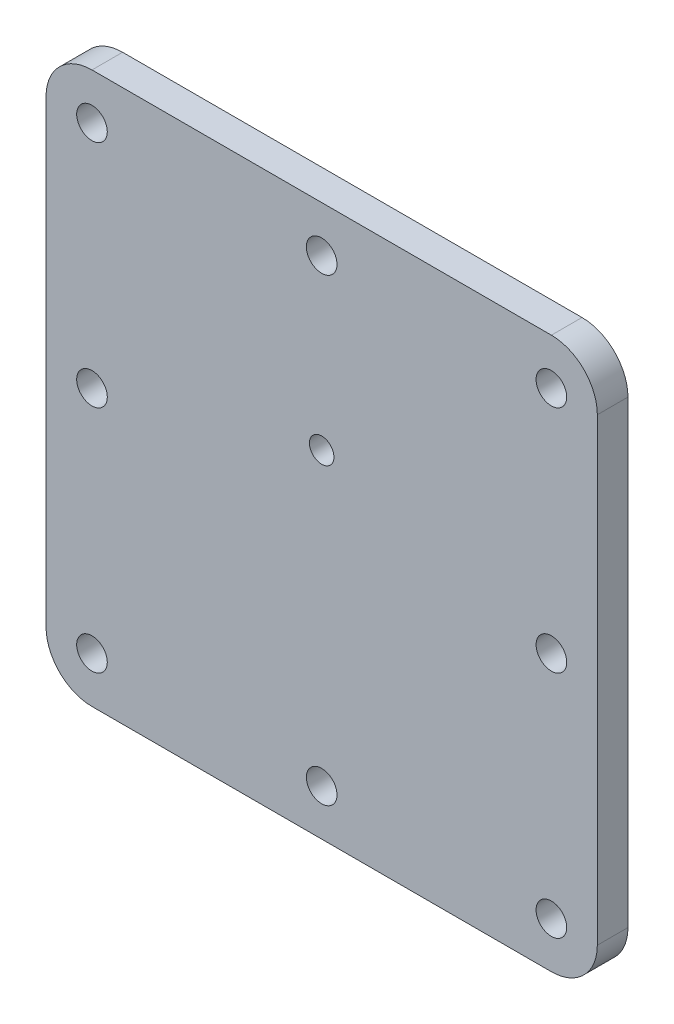
ISO-10303-21;
HEADER;
FILE_DESCRIPTION(('STEP AP214'),'2;1');
FILE_NAME('part.step','',(''),(''),'','','');
FILE_SCHEMA(('AUTOMOTIVE_DESIGN { 1 0 10303 214 1 1 1 1 }'));
ENDSEC;
DATA;
#1=APPLICATION_CONTEXT('core data for automotive mechanical design processes');
#2=APPLICATION_PROTOCOL_DEFINITION('international standard','automotive_design',2000,#1);
#3=PRODUCT_CONTEXT('',#1,'mechanical');
#4=PRODUCT('Part','Part','',(#3));
#5=PRODUCT_RELATED_PRODUCT_CATEGORY('part','',(#4));
#6=PRODUCT_DEFINITION_FORMATION('','',#4);
#7=PRODUCT_DEFINITION_CONTEXT('part definition',#1,'design');
#8=PRODUCT_DEFINITION('design','',#6,#7);
#9=PRODUCT_DEFINITION_SHAPE('','',#8);
#10=(LENGTH_UNIT() NAMED_UNIT(*) SI_UNIT(.MILLI.,.METRE.));
#11=(NAMED_UNIT(*) PLANE_ANGLE_UNIT() SI_UNIT($,.RADIAN.));
#12=(NAMED_UNIT(*) SI_UNIT($,.STERADIAN.) SOLID_ANGLE_UNIT());
#13=UNCERTAINTY_MEASURE_WITH_UNIT(LENGTH_MEASURE(1.E-05),#10,'distance_accuracy_value','');
#14=(GEOMETRIC_REPRESENTATION_CONTEXT(3) GLOBAL_UNCERTAINTY_ASSIGNED_CONTEXT((#13)) GLOBAL_UNIT_ASSIGNED_CONTEXT((#10,
#11,#12)) REPRESENTATION_CONTEXT('',''));
#15=CARTESIAN_POINT('',(0.,0.,0.));
#16=DIRECTION('',(0.,0.,1.));
#17=DIRECTION('',(1.,0.,0.));
#18=AXIS2_PLACEMENT_3D('',#15,#16,#17);
#19=CARTESIAN_POINT('',(-75.,-75.,10.));
#20=DIRECTION('',(0.,0.,1.));
#21=DIRECTION('',(1.,0.,0.));
#22=AXIS2_PLACEMENT_3D('',#19,#20,#21);
#23=PLANE('',#22);
#24=CARTESIAN_POINT('',(0.,20.,10.));
#25=DIRECTION('',(0.,0.,1.));
#26=DIRECTION('',(1.,0.,0.));
#27=AXIS2_PLACEMENT_3D('',#24,#25,#26);
#28=CIRCLE('',#27,4.);
#29=CARTESIAN_POINT('',(4.,20.,10.));
#30=VERTEX_POINT('',#29);
#31=EDGE_CURVE('E227',#30,#30,#28,.T.);
#32=ORIENTED_EDGE('',*,*,#31,.F.);
#33=EDGE_LOOP('',(#32));
#34=FACE_BOUND('',#33,.T.);
#35=CARTESIAN_POINT('',(1.54341102686378E-12,-75.,10.));
#36=DIRECTION('',(0.,0.,1.));
#37=DIRECTION('',(1.,0.,0.));
#38=AXIS2_PLACEMENT_3D('',#35,#36,#37);
#39=CIRCLE('',#38,5.);
#40=CARTESIAN_POINT('',(5.00000000000154,-75.,10.));
#41=VERTEX_POINT('',#40);
#42=EDGE_CURVE('E212',#41,#41,#39,.T.);
#43=ORIENTED_EDGE('',*,*,#42,.F.);
#44=EDGE_LOOP('',(#43));
#45=FACE_BOUND('',#44,.T.);
#46=CARTESIAN_POINT('',(75.0000000000008,0.,10.));
#47=DIRECTION('',(0.,0.,1.));
#48=DIRECTION('',(1.,0.,0.));
#49=AXIS2_PLACEMENT_3D('',#46,#47,#48);
#50=CIRCLE('',#49,5.);
#51=CARTESIAN_POINT('',(80.0000000000008,0.,10.));
#52=VERTEX_POINT('',#51);
#53=EDGE_CURVE('E200',#52,#52,#50,.T.);
#54=ORIENTED_EDGE('',*,*,#53,.F.);
#55=EDGE_LOOP('',(#54));
#56=FACE_BOUND('',#55,.T.);
#57=CARTESIAN_POINT('',(75.,75.,10.));
#58=DIRECTION('',(0.,0.,1.));
#59=DIRECTION('',(1.,0.,0.));
#60=AXIS2_PLACEMENT_3D('',#57,#58,#59);
#61=CIRCLE('',#60,5.00000000000001);
#62=CARTESIAN_POINT('',(80.,75.,10.));
#63=VERTEX_POINT('',#62);
#64=EDGE_CURVE('E188',#63,#63,#61,.T.);
#65=ORIENTED_EDGE('',*,*,#64,.F.);
#66=EDGE_LOOP('',(#65));
#67=FACE_BOUND('',#66,.T.);
#68=CARTESIAN_POINT('',(-75.,75.,10.));
#69=DIRECTION('',(0.,0.,1.));
#70=DIRECTION('',(1.,0.,0.));
#71=AXIS2_PLACEMENT_3D('',#68,#69,#70);
#72=CIRCLE('',#71,5.00000000000001);
#73=CARTESIAN_POINT('',(-70.,75.,10.));
#74=VERTEX_POINT('',#73);
#75=EDGE_CURVE('E134',#74,#74,#72,.T.);
#76=ORIENTED_EDGE('',*,*,#75,.F.);
#77=EDGE_LOOP('',(#76));
#78=FACE_BOUND('',#77,.T.);
#79=CARTESIAN_POINT('',(-75.,-75.,10.));
#80=DIRECTION('',(0.,0.,1.));
#81=DIRECTION('',(1.,0.,0.));
#82=AXIS2_PLACEMENT_3D('',#79,#80,#81);
#83=CIRCLE('',#82,15.);
#84=CARTESIAN_POINT('',(-90.,-74.9999999999999,10.));
#85=VERTEX_POINT('',#84);
#86=CARTESIAN_POINT('',(-74.9999999999999,-90.,10.));
#87=VERTEX_POINT('',#86);
#88=EDGE_CURVE('E145',#85,#87,#83,.T.);
#89=ORIENTED_EDGE('',*,*,#88,.T.);
#90=DIRECTION('',(1.,0.,0.));
#91=VECTOR('',#90,1.);
#92=CARTESIAN_POINT('',(-74.9999999999999,-90.,10.));
#93=LINE('',#92,#91);
#94=CARTESIAN_POINT('',(75.,-89.9999999999992,10.));
#95=VERTEX_POINT('',#94);
#96=EDGE_CURVE('E93',#87,#95,#93,.T.);
#97=ORIENTED_EDGE('',*,*,#96,.T.);
#98=CARTESIAN_POINT('',(75.,-74.9999999999992,10.));
#99=DIRECTION('',(0.,0.,1.));
#100=DIRECTION('',(1.,0.,0.));
#101=AXIS2_PLACEMENT_3D('',#98,#99,#100);
#102=CIRCLE('',#101,15.);
#103=CARTESIAN_POINT('',(90.,-75.,10.));
#104=VERTEX_POINT('',#103);
#105=EDGE_CURVE('E160',#95,#104,#102,.T.);
#106=ORIENTED_EDGE('',*,*,#105,.T.);
#107=DIRECTION('',(0.,1.,0.));
#108=VECTOR('',#107,1.);
#109=CARTESIAN_POINT('',(90.,75.0000000000019,10.));
#110=LINE('',#109,#108);
#111=CARTESIAN_POINT('',(90.,75.0000000000019,10.));
#112=VERTEX_POINT('',#111);
#113=EDGE_CURVE('E173',#104,#112,#110,.T.);
#114=ORIENTED_EDGE('',*,*,#113,.T.);
#115=CARTESIAN_POINT('',(75.,75.,10.));
#116=DIRECTION('',(0.,0.,1.));
#117=DIRECTION('',(-1.,0.,0.));
#118=AXIS2_PLACEMENT_3D('',#115,#116,#117);
#119=CIRCLE('',#118,15.);
#120=CARTESIAN_POINT('',(74.9999999999999,90.,10.));
#121=VERTEX_POINT('',#120);
#122=EDGE_CURVE('E112',#112,#121,#119,.T.);
#123=ORIENTED_EDGE('',*,*,#122,.T.);
#124=DIRECTION('',(-1.,0.,0.));
#125=VECTOR('',#124,1.);
#126=CARTESIAN_POINT('',(-74.9999999999999,90.,10.));
#127=LINE('',#126,#125);
#128=CARTESIAN_POINT('',(-74.9999999999999,90.,10.));
#129=VERTEX_POINT('',#128);
#130=EDGE_CURVE('E106',#121,#129,#127,.T.);
#131=ORIENTED_EDGE('',*,*,#130,.T.);
#132=CARTESIAN_POINT('',(-75.,75.,10.));
#133=DIRECTION('',(0.,0.,1.));
#134=DIRECTION('',(1.,0.,0.));
#135=AXIS2_PLACEMENT_3D('',#132,#133,#134);
#136=CIRCLE('',#135,15.);
#137=CARTESIAN_POINT('',(-90.,74.9999999999999,10.));
#138=VERTEX_POINT('',#137);
#139=EDGE_CURVE('E110',#129,#138,#136,.T.);
#140=ORIENTED_EDGE('',*,*,#139,.T.);
#141=DIRECTION('',(0.,-1.,0.));
#142=VECTOR('',#141,1.);
#143=CARTESIAN_POINT('',(-90.,74.9999999999999,10.));
#144=LINE('',#143,#142);
#145=EDGE_CURVE('E50',#138,#85,#144,.T.);
#146=ORIENTED_EDGE('',*,*,#145,.T.);
#147=EDGE_LOOP('',(#89,#97,#106,#114,#123,#131,#140,#146));
#148=FACE_BOUND('',#147,.T.);
#149=CARTESIAN_POINT('',(0.,75.,10.));
#150=DIRECTION('',(0.,0.,1.));
#151=DIRECTION('',(1.,0.,0.));
#152=AXIS2_PLACEMENT_3D('',#149,#150,#151);
#153=CIRCLE('',#152,5.);
#154=CARTESIAN_POINT('',(4.99999999999997,75.,10.));
#155=VERTEX_POINT('',#154);
#156=EDGE_CURVE('E182',#155,#155,#153,.T.);
#157=ORIENTED_EDGE('',*,*,#156,.F.);
#158=EDGE_LOOP('',(#157));
#159=FACE_BOUND('',#158,.T.);
#160=CARTESIAN_POINT('',(-74.9999999999992,0.,10.));
#161=DIRECTION('',(0.,0.,1.));
#162=DIRECTION('',(1.,0.,0.));
#163=AXIS2_PLACEMENT_3D('',#160,#161,#162);
#164=CIRCLE('',#163,5.);
#165=CARTESIAN_POINT('',(-69.9999999999992,0.,10.));
#166=VERTEX_POINT('',#165);
#167=EDGE_CURVE('E194',#166,#166,#164,.T.);
#168=ORIENTED_EDGE('',*,*,#167,.F.);
#169=EDGE_LOOP('',(#168));
#170=FACE_BOUND('',#169,.T.);
#171=CARTESIAN_POINT('',(-74.9999999999985,-75.,10.));
#172=DIRECTION('',(0.,0.,1.));
#173=DIRECTION('',(1.,0.,0.));
#174=AXIS2_PLACEMENT_3D('',#171,#172,#173);
#175=CIRCLE('',#174,5.00000000000001);
#176=CARTESIAN_POINT('',(-69.9999999999985,-75.,10.));
#177=VERTEX_POINT('',#176);
#178=EDGE_CURVE('E206',#177,#177,#175,.T.);
#179=ORIENTED_EDGE('',*,*,#178,.F.);
#180=EDGE_LOOP('',(#179));
#181=FACE_BOUND('',#180,.T.);
#182=CARTESIAN_POINT('',(75.0000000000015,-75.,10.));
#183=DIRECTION('',(0.,0.,1.));
#184=DIRECTION('',(1.,0.,0.));
#185=AXIS2_PLACEMENT_3D('',#182,#183,#184);
#186=CIRCLE('',#185,5.00000000000001);
#187=CARTESIAN_POINT('',(80.0000000000015,-75.,10.));
#188=VERTEX_POINT('',#187);
#189=EDGE_CURVE('E218',#188,#188,#186,.T.);
#190=ORIENTED_EDGE('',*,*,#189,.F.);
#191=EDGE_LOOP('',(#190));
#192=FACE_BOUND('',#191,.T.);
#193=ADVANCED_FACE('F33',(#34,#45,#56,#67,#78,#148,#159,#170,#181,#192),#23,.T.);
#194=CARTESIAN_POINT('',(-75.,-75.,0.));
#195=DIRECTION('',(0.,0.,1.));
#196=DIRECTION('',(1.,0.,0.));
#197=AXIS2_PLACEMENT_3D('',#194,#195,#196);
#198=PLANE('',#197);
#199=CARTESIAN_POINT('',(0.,20.,0.));
#200=DIRECTION('',(0.,0.,1.));
#201=DIRECTION('',(1.,0.,0.));
#202=AXIS2_PLACEMENT_3D('',#199,#200,#201);
#203=CIRCLE('',#202,4.);
#204=CARTESIAN_POINT('',(4.,20.,0.));
#205=VERTEX_POINT('',#204);
#206=EDGE_CURVE('E224',#205,#205,#203,.T.);
#207=ORIENTED_EDGE('',*,*,#206,.T.);
#208=EDGE_LOOP('',(#207));
#209=FACE_BOUND('',#208,.T.);
#210=CARTESIAN_POINT('',(-75.,-75.,0.));
#211=DIRECTION('',(0.,0.,1.));
#212=DIRECTION('',(1.,0.,0.));
#213=AXIS2_PLACEMENT_3D('',#210,#211,#212);
#214=CIRCLE('',#213,15.);
#215=CARTESIAN_POINT('',(-90.,-74.9999999999999,0.));
#216=VERTEX_POINT('',#215);
#217=CARTESIAN_POINT('',(-74.9999999999999,-90.,0.));
#218=VERTEX_POINT('',#217);
#219=EDGE_CURVE('E130',#216,#218,#214,.T.);
#220=ORIENTED_EDGE('',*,*,#219,.F.);
#221=DIRECTION('',(0.,-1.,0.));
#222=VECTOR('',#221,1.);
#223=CARTESIAN_POINT('',(-90.,74.9999999999999,0.));
#224=LINE('',#223,#222);
#225=CARTESIAN_POINT('',(-90.,74.9999999999999,0.));
#226=VERTEX_POINT('',#225);
#227=EDGE_CURVE('E85',#226,#216,#224,.T.);
#228=ORIENTED_EDGE('',*,*,#227,.F.);
#229=CARTESIAN_POINT('',(-75.,75.,0.));
#230=DIRECTION('',(0.,0.,1.));
#231=DIRECTION('',(1.,0.,0.));
#232=AXIS2_PLACEMENT_3D('',#229,#230,#231);
#233=CIRCLE('',#232,15.);
#234=CARTESIAN_POINT('',(-74.9999999999999,90.,0.));
#235=VERTEX_POINT('',#234);
#236=EDGE_CURVE('E79',#235,#226,#233,.T.);
#237=ORIENTED_EDGE('',*,*,#236,.F.);
#238=DIRECTION('',(-1.,0.,0.));
#239=VECTOR('',#238,1.);
#240=CARTESIAN_POINT('',(-74.9999999999999,90.,0.));
#241=LINE('',#240,#239);
#242=CARTESIAN_POINT('',(74.9999999999999,90.,0.));
#243=VERTEX_POINT('',#242);
#244=EDGE_CURVE('E120',#243,#235,#241,.T.);
#245=ORIENTED_EDGE('',*,*,#244,.F.);
#246=CARTESIAN_POINT('',(75.,75.,0.));
#247=DIRECTION('',(0.,0.,1.));
#248=DIRECTION('',(-1.,0.,0.));
#249=AXIS2_PLACEMENT_3D('',#246,#247,#248);
#250=CIRCLE('',#249,15.);
#251=CARTESIAN_POINT('',(90.,75.0000000000019,0.));
#252=VERTEX_POINT('',#251);
#253=EDGE_CURVE('E140',#252,#243,#250,.T.);
#254=ORIENTED_EDGE('',*,*,#253,.F.);
#255=DIRECTION('',(0.,1.,0.));
#256=VECTOR('',#255,1.);
#257=CARTESIAN_POINT('',(90.,75.0000000000019,0.));
#258=LINE('',#257,#256);
#259=CARTESIAN_POINT('',(90.,-75.,0.));
#260=VERTEX_POINT('',#259);
#261=EDGE_CURVE('E138',#260,#252,#258,.T.);
#262=ORIENTED_EDGE('',*,*,#261,.F.);
#263=CARTESIAN_POINT('',(75.,-74.9999999999992,0.));
#264=DIRECTION('',(0.,0.,1.));
#265=DIRECTION('',(1.,0.,0.));
#266=AXIS2_PLACEMENT_3D('',#263,#264,#265);
#267=CIRCLE('',#266,15.);
#268=CARTESIAN_POINT('',(75.,-89.9999999999992,0.));
#269=VERTEX_POINT('',#268);
#270=EDGE_CURVE('E136',#269,#260,#267,.T.);
#271=ORIENTED_EDGE('',*,*,#270,.F.);
#272=DIRECTION('',(1.,0.,0.));
#273=VECTOR('',#272,1.);
#274=CARTESIAN_POINT('',(-74.9999999999999,-90.,0.));
#275=LINE('',#274,#273);
#276=EDGE_CURVE('E133',#218,#269,#275,.T.);
#277=ORIENTED_EDGE('',*,*,#276,.F.);
#278=EDGE_LOOP('',(#220,#228,#237,#245,#254,#262,#271,#277));
#279=FACE_BOUND('',#278,.T.);
#280=CARTESIAN_POINT('',(-75.,75.,0.));
#281=DIRECTION('',(0.,0.,1.));
#282=DIRECTION('',(1.,0.,0.));
#283=AXIS2_PLACEMENT_3D('',#280,#281,#282);
#284=CIRCLE('',#283,5.00000000000001);
#285=CARTESIAN_POINT('',(-70.,75.,0.));
#286=VERTEX_POINT('',#285);
#287=EDGE_CURVE('E179',#286,#286,#284,.T.);
#288=ORIENTED_EDGE('',*,*,#287,.T.);
#289=EDGE_LOOP('',(#288));
#290=FACE_BOUND('',#289,.T.);
#291=CARTESIAN_POINT('',(0.,75.,0.));
#292=DIRECTION('',(0.,0.,1.));
#293=DIRECTION('',(1.,0.,0.));
#294=AXIS2_PLACEMENT_3D('',#291,#292,#293);
#295=CIRCLE('',#294,5.);
#296=CARTESIAN_POINT('',(4.99999999999997,75.,0.));
#297=VERTEX_POINT('',#296);
#298=EDGE_CURVE('E185',#297,#297,#295,.T.);
#299=ORIENTED_EDGE('',*,*,#298,.T.);
#300=EDGE_LOOP('',(#299));
#301=FACE_BOUND('',#300,.T.);
#302=CARTESIAN_POINT('',(75.,75.,0.));
#303=DIRECTION('',(0.,0.,1.));
#304=DIRECTION('',(1.,0.,0.));
#305=AXIS2_PLACEMENT_3D('',#302,#303,#304);
#306=CIRCLE('',#305,5.00000000000001);
#307=CARTESIAN_POINT('',(80.,75.,0.));
#308=VERTEX_POINT('',#307);
#309=EDGE_CURVE('E191',#308,#308,#306,.T.);
#310=ORIENTED_EDGE('',*,*,#309,.T.);
#311=EDGE_LOOP('',(#310));
#312=FACE_BOUND('',#311,.T.);
#313=CARTESIAN_POINT('',(-74.9999999999992,0.,0.));
#314=DIRECTION('',(0.,0.,1.));
#315=DIRECTION('',(1.,0.,0.));
#316=AXIS2_PLACEMENT_3D('',#313,#314,#315);
#317=CIRCLE('',#316,5.);
#318=CARTESIAN_POINT('',(-69.9999999999992,0.,0.));
#319=VERTEX_POINT('',#318);
#320=EDGE_CURVE('E197',#319,#319,#317,.T.);
#321=ORIENTED_EDGE('',*,*,#320,.T.);
#322=EDGE_LOOP('',(#321));
#323=FACE_BOUND('',#322,.T.);
#324=CARTESIAN_POINT('',(75.0000000000008,0.,0.));
#325=DIRECTION('',(0.,0.,1.));
#326=DIRECTION('',(1.,0.,0.));
#327=AXIS2_PLACEMENT_3D('',#324,#325,#326);
#328=CIRCLE('',#327,5.);
#329=CARTESIAN_POINT('',(80.0000000000008,0.,0.));
#330=VERTEX_POINT('',#329);
#331=EDGE_CURVE('E203',#330,#330,#328,.T.);
#332=ORIENTED_EDGE('',*,*,#331,.T.);
#333=EDGE_LOOP('',(#332));
#334=FACE_BOUND('',#333,.T.);
#335=CARTESIAN_POINT('',(-74.9999999999985,-75.,0.));
#336=DIRECTION('',(0.,0.,1.));
#337=DIRECTION('',(1.,0.,0.));
#338=AXIS2_PLACEMENT_3D('',#335,#336,#337);
#339=CIRCLE('',#338,5.00000000000001);
#340=CARTESIAN_POINT('',(-69.9999999999985,-75.,0.));
#341=VERTEX_POINT('',#340);
#342=EDGE_CURVE('E209',#341,#341,#339,.T.);
#343=ORIENTED_EDGE('',*,*,#342,.T.);
#344=EDGE_LOOP('',(#343));
#345=FACE_BOUND('',#344,.T.);
#346=CARTESIAN_POINT('',(1.54341102686378E-12,-75.,0.));
#347=DIRECTION('',(0.,0.,1.));
#348=DIRECTION('',(1.,0.,0.));
#349=AXIS2_PLACEMENT_3D('',#346,#347,#348);
#350=CIRCLE('',#349,5.);
#351=CARTESIAN_POINT('',(5.00000000000154,-75.,0.));
#352=VERTEX_POINT('',#351);
#353=EDGE_CURVE('E215',#352,#352,#350,.T.);
#354=ORIENTED_EDGE('',*,*,#353,.T.);
#355=EDGE_LOOP('',(#354));
#356=FACE_BOUND('',#355,.T.);
#357=CARTESIAN_POINT('',(75.0000000000015,-75.,0.));
#358=DIRECTION('',(0.,0.,1.));
#359=DIRECTION('',(1.,0.,0.));
#360=AXIS2_PLACEMENT_3D('',#357,#358,#359);
#361=CIRCLE('',#360,5.00000000000001);
#362=CARTESIAN_POINT('',(80.0000000000015,-75.,0.));
#363=VERTEX_POINT('',#362);
#364=EDGE_CURVE('E221',#363,#363,#361,.T.);
#365=ORIENTED_EDGE('',*,*,#364,.T.);
#366=EDGE_LOOP('',(#365));
#367=FACE_BOUND('',#366,.T.);
#368=ADVANCED_FACE('F164',(#209,#279,#290,#301,#312,#323,#334,#345,#356,#367),#198,.F.);
#369=CARTESIAN_POINT('',(-75.,-75.,10.));
#370=DIRECTION('',(0.,0.,-1.));
#371=DIRECTION('',(-1.,0.,0.));
#372=AXIS2_PLACEMENT_3D('',#369,#370,#371);
#373=CYLINDRICAL_SURFACE('',#372,15.);
#374=ORIENTED_EDGE('',*,*,#219,.T.);
#375=DIRECTION('',(0.,0.,-1.));
#376=VECTOR('',#375,1.);
#377=CARTESIAN_POINT('',(-74.9999999999999,-90.,10.));
#378=LINE('',#377,#376);
#379=EDGE_CURVE('E11',#87,#218,#378,.T.);
#380=ORIENTED_EDGE('',*,*,#379,.F.);
#381=ORIENTED_EDGE('',*,*,#88,.F.);
#382=DIRECTION('',(0.,0.,-1.));
#383=VECTOR('',#382,1.);
#384=CARTESIAN_POINT('',(-90.,-74.9999999999999,10.));
#385=LINE('',#384,#383);
#386=EDGE_CURVE('E126',#85,#216,#385,.T.);
#387=ORIENTED_EDGE('',*,*,#386,.T.);
#388=EDGE_LOOP('',(#374,#380,#381,#387));
#389=FACE_BOUND('',#388,.T.);
#390=ADVANCED_FACE('F35',(#389),#373,.T.);
#391=CARTESIAN_POINT('',(-74.9999999999999,-90.,10.));
#392=DIRECTION('',(0.,1.,0.));
#393=DIRECTION('',(-1.,0.,0.));
#394=AXIS2_PLACEMENT_3D('',#391,#392,#393);
#395=PLANE('',#394);
#396=ORIENTED_EDGE('',*,*,#276,.T.);
#397=DIRECTION('',(0.,0.,-1.));
#398=VECTOR('',#397,1.);
#399=CARTESIAN_POINT('',(75.,-89.9999999999992,10.));
#400=LINE('',#399,#398);
#401=EDGE_CURVE('E42',#95,#269,#400,.T.);
#402=ORIENTED_EDGE('',*,*,#401,.F.);
#403=ORIENTED_EDGE('',*,*,#96,.F.);
#404=ORIENTED_EDGE('',*,*,#379,.T.);
#405=EDGE_LOOP('',(#396,#402,#403,#404));
#406=FACE_BOUND('',#405,.T.);
#407=ADVANCED_FACE('F316',(#406),#395,.F.);
#408=CARTESIAN_POINT('',(75.,-74.9999999999992,10.));
#409=DIRECTION('',(0.,0.,-1.));
#410=DIRECTION('',(-1.,0.,0.));
#411=AXIS2_PLACEMENT_3D('',#408,#409,#410);
#412=CYLINDRICAL_SURFACE('',#411,15.);
#413=ORIENTED_EDGE('',*,*,#270,.T.);
#414=DIRECTION('',(0.,0.,-1.));
#415=VECTOR('',#414,1.);
#416=CARTESIAN_POINT('',(90.,-75.,10.));
#417=LINE('',#416,#415);
#418=EDGE_CURVE('E152',#104,#260,#417,.T.);
#419=ORIENTED_EDGE('',*,*,#418,.F.);
#420=ORIENTED_EDGE('',*,*,#105,.F.);
#421=ORIENTED_EDGE('',*,*,#401,.T.);
#422=EDGE_LOOP('',(#413,#419,#420,#421));
#423=FACE_BOUND('',#422,.T.);
#424=ADVANCED_FACE('F158',(#423),#412,.T.);
#425=CARTESIAN_POINT('',(90.,75.0000000000019,10.));
#426=DIRECTION('',(-1.,0.,0.));
#427=DIRECTION('',(0.,-1.,0.));
#428=AXIS2_PLACEMENT_3D('',#425,#426,#427);
#429=PLANE('',#428);
#430=ORIENTED_EDGE('',*,*,#261,.T.);
#431=DIRECTION('',(0.,0.,-1.));
#432=VECTOR('',#431,1.);
#433=CARTESIAN_POINT('',(90.,75.0000000000019,10.));
#434=LINE('',#433,#432);
#435=EDGE_CURVE('E149',#112,#252,#434,.T.);
#436=ORIENTED_EDGE('',*,*,#435,.F.);
#437=ORIENTED_EDGE('',*,*,#113,.F.);
#438=ORIENTED_EDGE('',*,*,#418,.T.);
#439=EDGE_LOOP('',(#430,#436,#437,#438));
#440=FACE_BOUND('',#439,.T.);
#441=ADVANCED_FACE('F169',(#440),#429,.F.);
#442=CARTESIAN_POINT('',(75.,75.,10.));
#443=DIRECTION('',(0.,0.,-1.));
#444=DIRECTION('',(-1.,0.,0.));
#445=AXIS2_PLACEMENT_3D('',#442,#443,#444);
#446=CYLINDRICAL_SURFACE('',#445,15.);
#447=ORIENTED_EDGE('',*,*,#253,.T.);
#448=DIRECTION('',(0.,0.,-1.));
#449=VECTOR('',#448,1.);
#450=CARTESIAN_POINT('',(74.9999999999999,90.,10.));
#451=LINE('',#450,#449);
#452=EDGE_CURVE('E121',#121,#243,#451,.T.);
#453=ORIENTED_EDGE('',*,*,#452,.F.);
#454=ORIENTED_EDGE('',*,*,#122,.F.);
#455=ORIENTED_EDGE('',*,*,#435,.T.);
#456=EDGE_LOOP('',(#447,#453,#454,#455));
#457=FACE_BOUND('',#456,.T.);
#458=ADVANCED_FACE('F172',(#457),#446,.T.);
#459=CARTESIAN_POINT('',(-74.9999999999999,90.,10.));
#460=DIRECTION('',(0.,-1.,0.));
#461=DIRECTION('',(0.,0.,-1.));
#462=AXIS2_PLACEMENT_3D('',#459,#460,#461);
#463=PLANE('',#462);
#464=ORIENTED_EDGE('',*,*,#244,.T.);
#465=DIRECTION('',(0.,0.,-1.));
#466=VECTOR('',#465,1.);
#467=CARTESIAN_POINT('',(-74.9999999999999,90.,10.));
#468=LINE('',#467,#466);
#469=EDGE_CURVE('E117',#129,#235,#468,.T.);
#470=ORIENTED_EDGE('',*,*,#469,.F.);
#471=ORIENTED_EDGE('',*,*,#130,.F.);
#472=ORIENTED_EDGE('',*,*,#452,.T.);
#473=EDGE_LOOP('',(#464,#470,#471,#472));
#474=FACE_BOUND('',#473,.T.);
#475=ADVANCED_FACE('F118',(#474),#463,.F.);
#476=CARTESIAN_POINT('',(-75.,75.,10.));
#477=DIRECTION('',(0.,0.,-1.));
#478=DIRECTION('',(-1.,0.,0.));
#479=AXIS2_PLACEMENT_3D('',#476,#477,#478);
#480=CYLINDRICAL_SURFACE('',#479,15.);
#481=ORIENTED_EDGE('',*,*,#236,.T.);
#482=DIRECTION('',(0.,0.,-1.));
#483=VECTOR('',#482,1.);
#484=CARTESIAN_POINT('',(-90.,74.9999999999999,10.));
#485=LINE('',#484,#483);
#486=EDGE_CURVE('E122',#138,#226,#485,.T.);
#487=ORIENTED_EDGE('',*,*,#486,.F.);
#488=ORIENTED_EDGE('',*,*,#139,.F.);
#489=ORIENTED_EDGE('',*,*,#469,.T.);
#490=EDGE_LOOP('',(#481,#487,#488,#489));
#491=FACE_BOUND('',#490,.T.);
#492=ADVANCED_FACE('F124',(#491),#480,.T.);
#493=CARTESIAN_POINT('',(-90.,74.9999999999999,10.));
#494=DIRECTION('',(1.,0.,0.));
#495=DIRECTION('',(0.,1.,0.));
#496=AXIS2_PLACEMENT_3D('',#493,#494,#495);
#497=PLANE('',#496);
#498=ORIENTED_EDGE('',*,*,#227,.T.);
#499=ORIENTED_EDGE('',*,*,#386,.F.);
#500=ORIENTED_EDGE('',*,*,#145,.F.);
#501=ORIENTED_EDGE('',*,*,#486,.T.);
#502=EDGE_LOOP('',(#498,#499,#500,#501));
#503=FACE_BOUND('',#502,.T.);
#504=ADVANCED_FACE('F256',(#503),#497,.F.);
#505=CARTESIAN_POINT('',(-75.,75.,10.));
#506=DIRECTION('',(0.,0.,-1.));
#507=DIRECTION('',(-1.,0.,0.));
#508=AXIS2_PLACEMENT_3D('',#505,#506,#507);
#509=CYLINDRICAL_SURFACE('',#508,5.00000000000001);
#510=ORIENTED_EDGE('',*,*,#75,.T.);
#511=EDGE_LOOP('',(#510));
#512=FACE_BOUND('',#511,.T.);
#513=ORIENTED_EDGE('',*,*,#287,.F.);
#514=EDGE_LOOP('',(#513));
#515=FACE_BOUND('',#514,.T.);
#516=ADVANCED_FACE('F252',(#512,#515),#509,.F.);
#517=CARTESIAN_POINT('',(0.,75.,10.));
#518=DIRECTION('',(0.,0.,-1.));
#519=DIRECTION('',(-1.,0.,0.));
#520=AXIS2_PLACEMENT_3D('',#517,#518,#519);
#521=CYLINDRICAL_SURFACE('',#520,5.);
#522=ORIENTED_EDGE('',*,*,#156,.T.);
#523=EDGE_LOOP('',(#522));
#524=FACE_BOUND('',#523,.T.);
#525=ORIENTED_EDGE('',*,*,#298,.F.);
#526=EDGE_LOOP('',(#525));
#527=FACE_BOUND('',#526,.T.);
#528=ADVANCED_FACE('F255',(#524,#527),#521,.F.);
#529=CARTESIAN_POINT('',(75.,75.,10.));
#530=DIRECTION('',(0.,0.,-1.));
#531=DIRECTION('',(-1.,0.,0.));
#532=AXIS2_PLACEMENT_3D('',#529,#530,#531);
#533=CYLINDRICAL_SURFACE('',#532,5.00000000000001);
#534=ORIENTED_EDGE('',*,*,#64,.T.);
#535=EDGE_LOOP('',(#534));
#536=FACE_BOUND('',#535,.T.);
#537=ORIENTED_EDGE('',*,*,#309,.F.);
#538=EDGE_LOOP('',(#537));
#539=FACE_BOUND('',#538,.T.);
#540=ADVANCED_FACE('F297',(#536,#539),#533,.F.);
#541=CARTESIAN_POINT('',(-74.9999999999992,0.,10.));
#542=DIRECTION('',(0.,0.,-1.));
#543=DIRECTION('',(-1.,0.,0.));
#544=AXIS2_PLACEMENT_3D('',#541,#542,#543);
#545=CYLINDRICAL_SURFACE('',#544,5.);
#546=ORIENTED_EDGE('',*,*,#167,.T.);
#547=EDGE_LOOP('',(#546));
#548=FACE_BOUND('',#547,.T.);
#549=ORIENTED_EDGE('',*,*,#320,.F.);
#550=EDGE_LOOP('',(#549));
#551=FACE_BOUND('',#550,.T.);
#552=ADVANCED_FACE('F293',(#548,#551),#545,.F.);
#553=CARTESIAN_POINT('',(75.0000000000008,0.,10.));
#554=DIRECTION('',(0.,0.,-1.));
#555=DIRECTION('',(-1.,0.,0.));
#556=AXIS2_PLACEMENT_3D('',#553,#554,#555);
#557=CYLINDRICAL_SURFACE('',#556,5.);
#558=ORIENTED_EDGE('',*,*,#53,.T.);
#559=EDGE_LOOP('',(#558));
#560=FACE_BOUND('',#559,.T.);
#561=ORIENTED_EDGE('',*,*,#331,.F.);
#562=EDGE_LOOP('',(#561));
#563=FACE_BOUND('',#562,.T.);
#564=ADVANCED_FACE('F289',(#560,#563),#557,.F.);
#565=CARTESIAN_POINT('',(-74.9999999999985,-75.,10.));
#566=DIRECTION('',(0.,0.,-1.));
#567=DIRECTION('',(-1.,0.,0.));
#568=AXIS2_PLACEMENT_3D('',#565,#566,#567);
#569=CYLINDRICAL_SURFACE('',#568,5.00000000000001);
#570=ORIENTED_EDGE('',*,*,#178,.T.);
#571=EDGE_LOOP('',(#570));
#572=FACE_BOUND('',#571,.T.);
#573=ORIENTED_EDGE('',*,*,#342,.F.);
#574=EDGE_LOOP('',(#573));
#575=FACE_BOUND('',#574,.T.);
#576=ADVANCED_FACE('F283',(#572,#575),#569,.F.);
#577=CARTESIAN_POINT('',(1.54341102686378E-12,-75.,10.));
#578=DIRECTION('',(0.,0.,-1.));
#579=DIRECTION('',(-1.,0.,0.));
#580=AXIS2_PLACEMENT_3D('',#577,#578,#579);
#581=CYLINDRICAL_SURFACE('',#580,5.);
#582=ORIENTED_EDGE('',*,*,#42,.T.);
#583=EDGE_LOOP('',(#582));
#584=FACE_BOUND('',#583,.T.);
#585=ORIENTED_EDGE('',*,*,#353,.F.);
#586=EDGE_LOOP('',(#585));
#587=FACE_BOUND('',#586,.T.);
#588=ADVANCED_FACE('F277',(#584,#587),#581,.F.);
#589=CARTESIAN_POINT('',(75.0000000000015,-75.,10.));
#590=DIRECTION('',(0.,0.,-1.));
#591=DIRECTION('',(-1.,0.,0.));
#592=AXIS2_PLACEMENT_3D('',#589,#590,#591);
#593=CYLINDRICAL_SURFACE('',#592,5.00000000000001);
#594=ORIENTED_EDGE('',*,*,#189,.T.);
#595=EDGE_LOOP('',(#594));
#596=FACE_BOUND('',#595,.T.);
#597=ORIENTED_EDGE('',*,*,#364,.F.);
#598=EDGE_LOOP('',(#597));
#599=FACE_BOUND('',#598,.T.);
#600=ADVANCED_FACE('F237',(#596,#599),#593,.F.);
#601=CARTESIAN_POINT('',(0.,20.,0.));
#602=DIRECTION('',(0.,0.,1.));
#603=DIRECTION('',(1.,0.,0.));
#604=AXIS2_PLACEMENT_3D('',#601,#602,#603);
#605=CYLINDRICAL_SURFACE('',#604,4.);
#606=ORIENTED_EDGE('',*,*,#206,.F.);
#607=EDGE_LOOP('',(#606));
#608=FACE_BOUND('',#607,.T.);
#609=ORIENTED_EDGE('',*,*,#31,.T.);
#610=EDGE_LOOP('',(#609));
#611=FACE_BOUND('',#610,.T.);
#612=ADVANCED_FACE('F234',(#608,#611),#605,.F.);
#613=CLOSED_SHELL('',(#193,#368,#390,#407,#424,#441,#458,#475,#492,#504,#516,#528,#540,#552,
#564,#576,#588,#600,#612));
#614=MANIFOLD_SOLID_BREP('B2',#613);
#615=ADVANCED_BREP_SHAPE_REPRESENTATION('',(#18,#614),#14);
#616=SHAPE_DEFINITION_REPRESENTATION(#9,#615);
ENDSEC;
END-ISO-10303-21;
